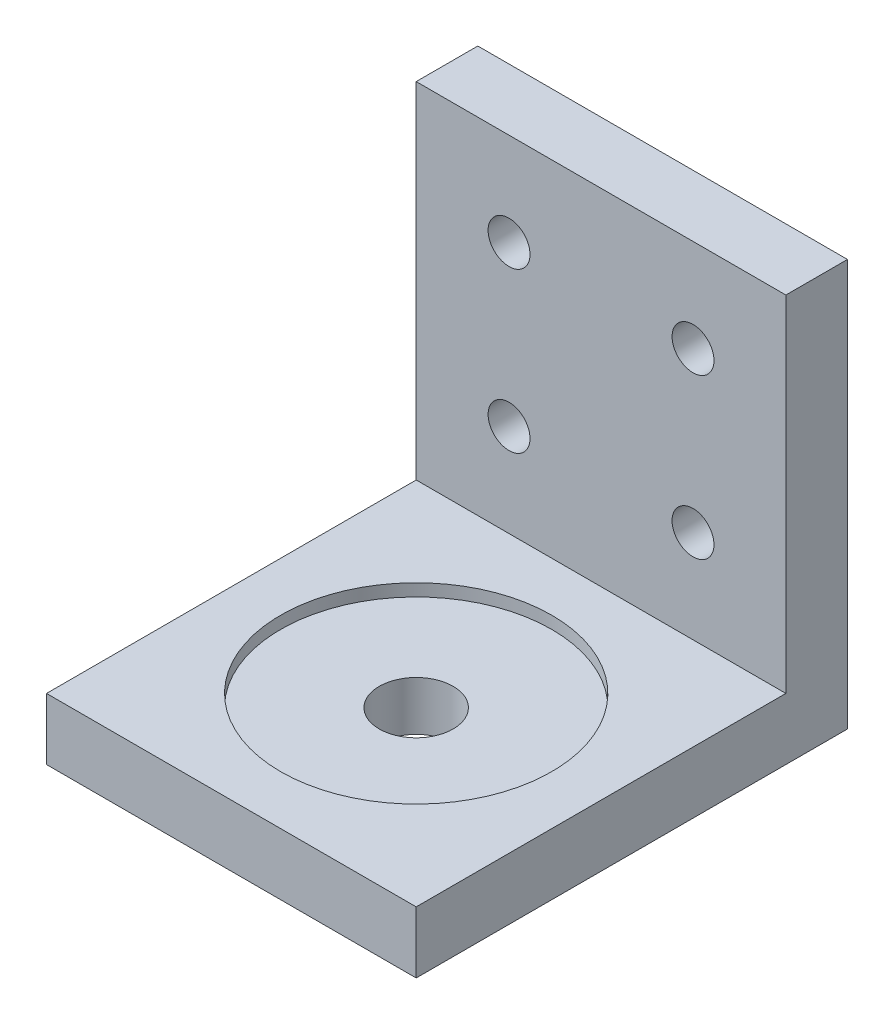
ISO-10303-21;
HEADER;
FILE_DESCRIPTION(('STEP AP214'),'2;1');
FILE_NAME('part.step','',(''),(''),'','','');
FILE_SCHEMA(('AUTOMOTIVE_DESIGN { 1 0 10303 214 1 1 1 1 }'));
ENDSEC;
DATA;
#1=APPLICATION_CONTEXT('core data for automotive mechanical design processes');
#2=APPLICATION_PROTOCOL_DEFINITION('international standard','automotive_design',2000,#1);
#3=PRODUCT_CONTEXT('',#1,'mechanical');
#4=PRODUCT('Part','Part','',(#3));
#5=PRODUCT_RELATED_PRODUCT_CATEGORY('part','',(#4));
#6=PRODUCT_DEFINITION_FORMATION('','',#4);
#7=PRODUCT_DEFINITION_CONTEXT('part definition',#1,'design');
#8=PRODUCT_DEFINITION('design','',#6,#7);
#9=PRODUCT_DEFINITION_SHAPE('','',#8);
#10=(LENGTH_UNIT() NAMED_UNIT(*) SI_UNIT(.MILLI.,.METRE.));
#11=(NAMED_UNIT(*) PLANE_ANGLE_UNIT() SI_UNIT($,.RADIAN.));
#12=(NAMED_UNIT(*) SI_UNIT($,.STERADIAN.) SOLID_ANGLE_UNIT());
#13=UNCERTAINTY_MEASURE_WITH_UNIT(LENGTH_MEASURE(1.E-05),#10,'distance_accuracy_value','');
#14=(GEOMETRIC_REPRESENTATION_CONTEXT(3) GLOBAL_UNCERTAINTY_ASSIGNED_CONTEXT((#13)) GLOBAL_UNIT_ASSIGNED_CONTEXT((#10,
#11,#12)) REPRESENTATION_CONTEXT('',''));
#15=CARTESIAN_POINT('',(0.,0.,0.));
#16=DIRECTION('',(0.,0.,1.));
#17=DIRECTION('',(1.,0.,0.));
#18=AXIS2_PLACEMENT_3D('',#15,#16,#17);
#19=CARTESIAN_POINT('',(-15.,5.,18.6650246305419));
#20=DIRECTION('',(1.,0.,0.));
#21=DIRECTION('',(0.,0.,-1.));
#22=AXIS2_PLACEMENT_3D('',#19,#20,#21);
#23=PLANE('',#22);
#24=DIRECTION('',(0.,0.,1.));
#25=VECTOR('',#24,1.);
#26=CARTESIAN_POINT('',(-15.,0.,18.6650246305419));
#27=LINE('',#26,#25);
#28=CARTESIAN_POINT('',(-15.,0.,-16.3349753694581));
#29=VERTEX_POINT('',#28);
#30=CARTESIAN_POINT('',(-15.,0.,18.6650246305419));
#31=VERTEX_POINT('',#30);
#32=EDGE_CURVE('E103',#29,#31,#27,.T.);
#33=ORIENTED_EDGE('',*,*,#32,.T.);
#34=DIRECTION('',(0.,-1.,0.));
#35=VECTOR('',#34,1.);
#36=CARTESIAN_POINT('',(-15.,5.,18.6650246305419));
#37=LINE('',#36,#35);
#38=CARTESIAN_POINT('',(-15.,5.,18.6650246305419));
#39=VERTEX_POINT('',#38);
#40=EDGE_CURVE('E11',#39,#31,#37,.T.);
#41=ORIENTED_EDGE('',*,*,#40,.F.);
#42=DIRECTION('',(0.,0.,1.));
#43=VECTOR('',#42,1.);
#44=CARTESIAN_POINT('',(-15.,5.,18.6650246305419));
#45=LINE('',#44,#43);
#46=CARTESIAN_POINT('',(-15.,5.,-11.3349753694581));
#47=VERTEX_POINT('',#46);
#48=EDGE_CURVE('E92',#47,#39,#45,.T.);
#49=ORIENTED_EDGE('',*,*,#48,.F.);
#50=DIRECTION('',(0.,-1.,0.));
#51=VECTOR('',#50,1.);
#52=CARTESIAN_POINT('',(-15.,33.,-11.3349753694581));
#53=LINE('',#52,#51);
#54=CARTESIAN_POINT('',(-15.,33.,-11.3349753694581));
#55=VERTEX_POINT('',#54);
#56=EDGE_CURVE('E60',#55,#47,#53,.T.);
#57=ORIENTED_EDGE('',*,*,#56,.F.);
#58=DIRECTION('',(0.,0.,1.));
#59=VECTOR('',#58,1.);
#60=CARTESIAN_POINT('',(-15.,33.,-11.3349753694581));
#61=LINE('',#60,#59);
#62=CARTESIAN_POINT('',(-15.,33.,-16.3349753694581));
#63=VERTEX_POINT('',#62);
#64=EDGE_CURVE('E145',#63,#55,#61,.T.);
#65=ORIENTED_EDGE('',*,*,#64,.F.);
#66=DIRECTION('',(0.,-1.,0.));
#67=VECTOR('',#66,1.);
#68=CARTESIAN_POINT('',(-15.,33.,-16.3349753694581));
#69=LINE('',#68,#67);
#70=EDGE_CURVE('E106',#63,#29,#69,.T.);
#71=ORIENTED_EDGE('',*,*,#70,.T.);
#72=EDGE_LOOP('',(#33,#41,#49,#57,#65,#71));
#73=FACE_BOUND('',#72,.T.);
#74=ADVANCED_FACE('F39',(#73),#23,.F.);
#75=CARTESIAN_POINT('',(15.,5.,18.6650246305419));
#76=DIRECTION('',(0.,0.,-1.));
#77=DIRECTION('',(-1.,0.,0.));
#78=AXIS2_PLACEMENT_3D('',#75,#76,#77);
#79=PLANE('',#78);
#80=DIRECTION('',(1.,0.,0.));
#81=VECTOR('',#80,1.);
#82=CARTESIAN_POINT('',(15.,0.,18.6650246305419));
#83=LINE('',#82,#81);
#84=CARTESIAN_POINT('',(15.,0.,18.6650246305419));
#85=VERTEX_POINT('',#84);
#86=EDGE_CURVE('E67',#31,#85,#83,.T.);
#87=ORIENTED_EDGE('',*,*,#86,.T.);
#88=DIRECTION('',(0.,-1.,0.));
#89=VECTOR('',#88,1.);
#90=CARTESIAN_POINT('',(15.,5.,18.6650246305419));
#91=LINE('',#90,#89);
#92=CARTESIAN_POINT('',(15.,5.,18.6650246305419));
#93=VERTEX_POINT('',#92);
#94=EDGE_CURVE('E48',#93,#85,#91,.T.);
#95=ORIENTED_EDGE('',*,*,#94,.F.);
#96=DIRECTION('',(1.,0.,0.));
#97=VECTOR('',#96,1.);
#98=CARTESIAN_POINT('',(15.,5.,18.6650246305419));
#99=LINE('',#98,#97);
#100=EDGE_CURVE('E82',#39,#93,#99,.T.);
#101=ORIENTED_EDGE('',*,*,#100,.F.);
#102=ORIENTED_EDGE('',*,*,#40,.T.);
#103=EDGE_LOOP('',(#87,#95,#101,#102));
#104=FACE_BOUND('',#103,.T.);
#105=ADVANCED_FACE('F87',(#104),#79,.F.);
#106=CARTESIAN_POINT('',(15.,5.,18.6650246305419));
#107=DIRECTION('',(-1.,0.,0.));
#108=DIRECTION('',(0.,0.,1.));
#109=AXIS2_PLACEMENT_3D('',#106,#107,#108);
#110=PLANE('',#109);
#111=DIRECTION('',(0.,0.,-1.));
#112=VECTOR('',#111,1.);
#113=CARTESIAN_POINT('',(15.,0.,18.6650246305419));
#114=LINE('',#113,#112);
#115=CARTESIAN_POINT('',(15.,0.,-16.3349753694581));
#116=VERTEX_POINT('',#115);
#117=EDGE_CURVE('E99',#85,#116,#114,.T.);
#118=ORIENTED_EDGE('',*,*,#117,.T.);
#119=DIRECTION('',(0.,-1.,0.));
#120=VECTOR('',#119,1.);
#121=CARTESIAN_POINT('',(15.,33.,-16.3349753694581));
#122=LINE('',#121,#120);
#123=CARTESIAN_POINT('',(15.,33.,-16.3349753694581));
#124=VERTEX_POINT('',#123);
#125=EDGE_CURVE('E146',#124,#116,#122,.T.);
#126=ORIENTED_EDGE('',*,*,#125,.F.);
#127=DIRECTION('',(0.,0.,-1.));
#128=VECTOR('',#127,1.);
#129=CARTESIAN_POINT('',(15.,33.,-11.3349753694581));
#130=LINE('',#129,#128);
#131=CARTESIAN_POINT('',(15.,33.,-11.3349753694581));
#132=VERTEX_POINT('',#131);
#133=EDGE_CURVE('E137',#132,#124,#130,.T.);
#134=ORIENTED_EDGE('',*,*,#133,.F.);
#135=DIRECTION('',(0.,-1.,0.));
#136=VECTOR('',#135,1.);
#137=CARTESIAN_POINT('',(15.,33.,-11.3349753694581));
#138=LINE('',#137,#136);
#139=CARTESIAN_POINT('',(15.,5.,-11.3349753694581));
#140=VERTEX_POINT('',#139);
#141=EDGE_CURVE('E147',#132,#140,#138,.T.);
#142=ORIENTED_EDGE('',*,*,#141,.T.);
#143=DIRECTION('',(0.,0.,-1.));
#144=VECTOR('',#143,1.);
#145=CARTESIAN_POINT('',(15.,5.,18.6650246305419));
#146=LINE('',#145,#144);
#147=EDGE_CURVE('E94',#93,#140,#146,.T.);
#148=ORIENTED_EDGE('',*,*,#147,.F.);
#149=ORIENTED_EDGE('',*,*,#94,.T.);
#150=EDGE_LOOP('',(#118,#126,#134,#142,#148,#149));
#151=FACE_BOUND('',#150,.T.);
#152=ADVANCED_FACE('F152',(#151),#110,.F.);
#153=CARTESIAN_POINT('',(0.,5.,0.));
#154=DIRECTION('',(0.,1.,0.));
#155=DIRECTION('',(0.,0.,1.));
#156=AXIS2_PLACEMENT_3D('',#153,#154,#155);
#157=PLANE('',#156);
#158=CARTESIAN_POINT('',(0.,5.,3.66502463054187));
#159=DIRECTION('',(0.,1.,0.));
#160=DIRECTION('',(0.,0.,1.));
#161=AXIS2_PLACEMENT_3D('',#158,#159,#160);
#162=CIRCLE('',#161,11.);
#163=CARTESIAN_POINT('',(0.,5.,14.6650246305419));
#164=VERTEX_POINT('',#163);
#165=EDGE_CURVE('E114',#164,#164,#162,.T.);
#166=ORIENTED_EDGE('',*,*,#165,.F.);
#167=EDGE_LOOP('',(#166));
#168=FACE_BOUND('',#167,.T.);
#169=ORIENTED_EDGE('',*,*,#48,.T.);
#170=ORIENTED_EDGE('',*,*,#100,.T.);
#171=ORIENTED_EDGE('',*,*,#147,.T.);
#172=DIRECTION('',(-1.,0.,0.));
#173=VECTOR('',#172,1.);
#174=CARTESIAN_POINT('',(15.,5.,-11.3349753694581));
#175=LINE('',#174,#173);
#176=EDGE_CURVE('E74',#140,#47,#175,.T.);
#177=ORIENTED_EDGE('',*,*,#176,.T.);
#178=EDGE_LOOP('',(#169,#170,#171,#177));
#179=FACE_BOUND('',#178,.T.);
#180=ADVANCED_FACE('F98',(#168,#179),#157,.T.);
#181=CARTESIAN_POINT('',(0.,0.,0.));
#182=DIRECTION('',(0.,1.,0.));
#183=DIRECTION('',(0.,0.,1.));
#184=AXIS2_PLACEMENT_3D('',#181,#182,#183);
#185=PLANE('',#184);
#186=CARTESIAN_POINT('',(0.,0.,3.66502463054187));
#187=DIRECTION('',(0.,1.,0.));
#188=DIRECTION('',(0.,0.,1.));
#189=AXIS2_PLACEMENT_3D('',#186,#187,#188);
#190=CIRCLE('',#189,3.);
#191=CARTESIAN_POINT('',(0.,0.,6.66502463054187));
#192=VERTEX_POINT('',#191);
#193=EDGE_CURVE('E45',#192,#192,#190,.T.);
#194=ORIENTED_EDGE('',*,*,#193,.T.);
#195=EDGE_LOOP('',(#194));
#196=FACE_BOUND('',#195,.T.);
#197=ORIENTED_EDGE('',*,*,#32,.F.);
#198=DIRECTION('',(-1.,0.,0.));
#199=VECTOR('',#198,1.);
#200=CARTESIAN_POINT('',(15.,0.,-16.3349753694581));
#201=LINE('',#200,#199);
#202=EDGE_CURVE('E135',#116,#29,#201,.T.);
#203=ORIENTED_EDGE('',*,*,#202,.F.);
#204=ORIENTED_EDGE('',*,*,#117,.F.);
#205=ORIENTED_EDGE('',*,*,#86,.F.);
#206=EDGE_LOOP('',(#197,#203,#204,#205));
#207=FACE_BOUND('',#206,.T.);
#208=ADVANCED_FACE('F166',(#196,#207),#185,.F.);
#209=CARTESIAN_POINT('',(0.,4.,3.66502463054187));
#210=DIRECTION('',(0.,1.,0.));
#211=DIRECTION('',(0.,0.,1.));
#212=AXIS2_PLACEMENT_3D('',#209,#210,#211);
#213=CYLINDRICAL_SURFACE('',#212,11.);
#214=CARTESIAN_POINT('',(0.,4.,3.66502463054187));
#215=DIRECTION('',(0.,1.,0.));
#216=DIRECTION('',(0.,0.,1.));
#217=AXIS2_PLACEMENT_3D('',#214,#215,#216);
#218=CIRCLE('',#217,11.);
#219=CARTESIAN_POINT('',(0.,4.,14.6650246305419));
#220=VERTEX_POINT('',#219);
#221=EDGE_CURVE('E108',#220,#220,#218,.T.);
#222=ORIENTED_EDGE('',*,*,#221,.F.);
#223=EDGE_LOOP('',(#222));
#224=FACE_BOUND('',#223,.T.);
#225=ORIENTED_EDGE('',*,*,#165,.T.);
#226=EDGE_LOOP('',(#225));
#227=FACE_BOUND('',#226,.T.);
#228=ADVANCED_FACE('F171',(#224,#227),#213,.F.);
#229=CARTESIAN_POINT('',(0.,4.,3.66502463054187));
#230=DIRECTION('',(0.,1.,0.));
#231=DIRECTION('',(0.,0.,1.));
#232=AXIS2_PLACEMENT_3D('',#229,#230,#231);
#233=PLANE('',#232);
#234=CARTESIAN_POINT('',(0.,4.,3.66502463054187));
#235=DIRECTION('',(0.,1.,0.));
#236=DIRECTION('',(0.,0.,1.));
#237=AXIS2_PLACEMENT_3D('',#234,#235,#236);
#238=CIRCLE('',#237,3.);
#239=CARTESIAN_POINT('',(0.,4.,6.66502463054187));
#240=VERTEX_POINT('',#239);
#241=EDGE_CURVE('E319',#240,#240,#238,.T.);
#242=ORIENTED_EDGE('',*,*,#241,.F.);
#243=EDGE_LOOP('',(#242));
#244=FACE_BOUND('',#243,.T.);
#245=ORIENTED_EDGE('',*,*,#221,.T.);
#246=EDGE_LOOP('',(#245));
#247=FACE_BOUND('',#246,.T.);
#248=ADVANCED_FACE('F179',(#244,#247),#233,.T.);
#249=CARTESIAN_POINT('',(-15.,33.,-11.3349753694581));
#250=DIRECTION('',(0.,0.,-1.));
#251=DIRECTION('',(-1.,0.,0.));
#252=AXIS2_PLACEMENT_3D('',#249,#250,#251);
#253=PLANE('',#252);
#254=CARTESIAN_POINT('',(-7.46435652487382,25.4675408555637,-11.3349753694581));
#255=DIRECTION('',(0.,0.,1.));
#256=DIRECTION('',(-1.,0.,0.));
#257=AXIS2_PLACEMENT_3D('',#254,#255,#256);
#258=CIRCLE('',#257,1.7);
#259=CARTESIAN_POINT('',(-9.16435652487382,25.4675408555637,-11.3349753694581));
#260=VERTEX_POINT('',#259);
#261=EDGE_CURVE('E324',#260,#260,#258,.T.);
#262=ORIENTED_EDGE('',*,*,#261,.F.);
#263=EDGE_LOOP('',(#262));
#264=FACE_BOUND('',#263,.T.);
#265=CARTESIAN_POINT('',(7.46435652487382,25.4675408555637,-11.3349753694581));
#266=DIRECTION('',(0.,0.,1.));
#267=DIRECTION('',(1.,0.,0.));
#268=AXIS2_PLACEMENT_3D('',#265,#266,#267);
#269=CIRCLE('',#268,1.7);
#270=CARTESIAN_POINT('',(9.16435652487382,25.4675408555637,-11.3349753694581));
#271=VERTEX_POINT('',#270);
#272=EDGE_CURVE('E329',#271,#271,#269,.T.);
#273=ORIENTED_EDGE('',*,*,#272,.F.);
#274=EDGE_LOOP('',(#273));
#275=FACE_BOUND('',#274,.T.);
#276=CARTESIAN_POINT('',(7.46435652487382,12.5324591444364,-11.3349753694581));
#277=DIRECTION('',(0.,0.,1.));
#278=DIRECTION('',(-1.,0.,0.));
#279=AXIS2_PLACEMENT_3D('',#276,#277,#278);
#280=CIRCLE('',#279,1.7);
#281=CARTESIAN_POINT('',(5.76435652487382,12.5324591444364,-11.3349753694581));
#282=VERTEX_POINT('',#281);
#283=EDGE_CURVE('E330',#282,#282,#280,.T.);
#284=ORIENTED_EDGE('',*,*,#283,.F.);
#285=EDGE_LOOP('',(#284));
#286=FACE_BOUND('',#285,.T.);
#287=CARTESIAN_POINT('',(-7.46435652487382,12.5324591444364,-11.3349753694581));
#288=DIRECTION('',(0.,0.,1.));
#289=DIRECTION('',(1.,0.,0.));
#290=AXIS2_PLACEMENT_3D('',#287,#288,#289);
#291=CIRCLE('',#290,1.7);
#292=CARTESIAN_POINT('',(-5.76435652487382,12.5324591444364,-11.3349753694581));
#293=VERTEX_POINT('',#292);
#294=EDGE_CURVE('E122',#293,#293,#291,.T.);
#295=ORIENTED_EDGE('',*,*,#294,.F.);
#296=EDGE_LOOP('',(#295));
#297=FACE_BOUND('',#296,.T.);
#298=ORIENTED_EDGE('',*,*,#176,.F.);
#299=ORIENTED_EDGE('',*,*,#141,.F.);
#300=DIRECTION('',(1.,0.,0.));
#301=VECTOR('',#300,1.);
#302=CARTESIAN_POINT('',(-15.,33.,-11.3349753694581));
#303=LINE('',#302,#301);
#304=EDGE_CURVE('E134',#55,#132,#303,.T.);
#305=ORIENTED_EDGE('',*,*,#304,.F.);
#306=ORIENTED_EDGE('',*,*,#56,.T.);
#307=EDGE_LOOP('',(#298,#299,#305,#306));
#308=FACE_BOUND('',#307,.T.);
#309=ADVANCED_FACE('F157',(#264,#275,#286,#297,#308),#253,.F.);
#310=CARTESIAN_POINT('',(15.,33.,-16.3349753694581));
#311=DIRECTION('',(0.,0.,1.));
#312=DIRECTION('',(1.,0.,0.));
#313=AXIS2_PLACEMENT_3D('',#310,#311,#312);
#314=PLANE('',#313);
#315=CARTESIAN_POINT('',(-7.46435652487382,25.4675408555637,-16.3349753694581));
#316=DIRECTION('',(0.,0.,1.));
#317=DIRECTION('',(1.,0.,0.));
#318=AXIS2_PLACEMENT_3D('',#315,#316,#317);
#319=CIRCLE('',#318,1.7);
#320=CARTESIAN_POINT('',(-5.76435652487382,25.4675408555637,-16.3349753694581));
#321=VERTEX_POINT('',#320);
#322=EDGE_CURVE('E128',#321,#321,#319,.T.);
#323=ORIENTED_EDGE('',*,*,#322,.T.);
#324=EDGE_LOOP('',(#323));
#325=FACE_BOUND('',#324,.T.);
#326=CARTESIAN_POINT('',(7.46435652487382,25.4675408555637,-16.3349753694581));
#327=DIRECTION('',(0.,0.,1.));
#328=DIRECTION('',(1.,0.,0.));
#329=AXIS2_PLACEMENT_3D('',#326,#327,#328);
#330=CIRCLE('',#329,1.7);
#331=CARTESIAN_POINT('',(9.16435652487382,25.4675408555637,-16.3349753694581));
#332=VERTEX_POINT('',#331);
#333=EDGE_CURVE('E126',#332,#332,#330,.T.);
#334=ORIENTED_EDGE('',*,*,#333,.T.);
#335=EDGE_LOOP('',(#334));
#336=FACE_BOUND('',#335,.T.);
#337=CARTESIAN_POINT('',(7.46435652487382,12.5324591444364,-16.3349753694581));
#338=DIRECTION('',(0.,0.,1.));
#339=DIRECTION('',(1.,0.,0.));
#340=AXIS2_PLACEMENT_3D('',#337,#338,#339);
#341=CIRCLE('',#340,1.7);
#342=CARTESIAN_POINT('',(9.16435652487382,12.5324591444364,-16.3349753694581));
#343=VERTEX_POINT('',#342);
#344=EDGE_CURVE('E124',#343,#343,#341,.T.);
#345=ORIENTED_EDGE('',*,*,#344,.T.);
#346=EDGE_LOOP('',(#345));
#347=FACE_BOUND('',#346,.T.);
#348=CARTESIAN_POINT('',(-7.46435652487382,12.5324591444364,-16.3349753694581));
#349=DIRECTION('',(0.,0.,1.));
#350=DIRECTION('',(1.,0.,0.));
#351=AXIS2_PLACEMENT_3D('',#348,#349,#350);
#352=CIRCLE('',#351,1.7);
#353=CARTESIAN_POINT('',(-5.76435652487382,12.5324591444364,-16.3349753694581));
#354=VERTEX_POINT('',#353);
#355=EDGE_CURVE('E123',#354,#354,#352,.T.);
#356=ORIENTED_EDGE('',*,*,#355,.T.);
#357=EDGE_LOOP('',(#356));
#358=FACE_BOUND('',#357,.T.);
#359=ORIENTED_EDGE('',*,*,#202,.T.);
#360=ORIENTED_EDGE('',*,*,#70,.F.);
#361=DIRECTION('',(-1.,0.,0.));
#362=VECTOR('',#361,1.);
#363=CARTESIAN_POINT('',(15.,33.,-16.3349753694581));
#364=LINE('',#363,#362);
#365=EDGE_CURVE('E169',#124,#63,#364,.T.);
#366=ORIENTED_EDGE('',*,*,#365,.F.);
#367=ORIENTED_EDGE('',*,*,#125,.T.);
#368=EDGE_LOOP('',(#359,#360,#366,#367));
#369=FACE_BOUND('',#368,.T.);
#370=ADVANCED_FACE('F170',(#325,#336,#347,#358,#369),#314,.F.);
#371=CARTESIAN_POINT('',(0.,33.,0.));
#372=DIRECTION('',(0.,1.,0.));
#373=DIRECTION('',(0.,0.,1.));
#374=AXIS2_PLACEMENT_3D('',#371,#372,#373);
#375=PLANE('',#374);
#376=ORIENTED_EDGE('',*,*,#304,.T.);
#377=ORIENTED_EDGE('',*,*,#133,.T.);
#378=ORIENTED_EDGE('',*,*,#365,.T.);
#379=ORIENTED_EDGE('',*,*,#64,.T.);
#380=EDGE_LOOP('',(#376,#377,#378,#379));
#381=FACE_BOUND('',#380,.T.);
#382=ADVANCED_FACE('F206',(#381),#375,.T.);
#383=CARTESIAN_POINT('',(-7.46435652487382,12.5324591444364,-20.7129753694581));
#384=DIRECTION('',(0.,0.,1.));
#385=DIRECTION('',(1.,0.,0.));
#386=AXIS2_PLACEMENT_3D('',#383,#384,#385);
#387=CYLINDRICAL_SURFACE('',#386,1.7);
#388=ORIENTED_EDGE('',*,*,#294,.T.);
#389=EDGE_LOOP('',(#388));
#390=FACE_BOUND('',#389,.T.);
#391=ORIENTED_EDGE('',*,*,#355,.F.);
#392=EDGE_LOOP('',(#391));
#393=FACE_BOUND('',#392,.T.);
#394=ADVANCED_FACE('F209',(#390,#393),#387,.F.);
#395=CARTESIAN_POINT('',(7.46435652487382,12.5324591444364,-20.7129753694581));
#396=DIRECTION('',(0.,0.,1.));
#397=DIRECTION('',(1.,0.,0.));
#398=AXIS2_PLACEMENT_3D('',#395,#396,#397);
#399=CYLINDRICAL_SURFACE('',#398,1.7);
#400=ORIENTED_EDGE('',*,*,#283,.T.);
#401=EDGE_LOOP('',(#400));
#402=FACE_BOUND('',#401,.T.);
#403=ORIENTED_EDGE('',*,*,#344,.F.);
#404=EDGE_LOOP('',(#403));
#405=FACE_BOUND('',#404,.T.);
#406=ADVANCED_FACE('F234',(#402,#405),#399,.F.);
#407=CARTESIAN_POINT('',(7.46435652487382,25.4675408555637,-20.7129753694581));
#408=DIRECTION('',(0.,0.,1.));
#409=DIRECTION('',(1.,0.,0.));
#410=AXIS2_PLACEMENT_3D('',#407,#408,#409);
#411=CYLINDRICAL_SURFACE('',#410,1.7);
#412=ORIENTED_EDGE('',*,*,#272,.T.);
#413=EDGE_LOOP('',(#412));
#414=FACE_BOUND('',#413,.T.);
#415=ORIENTED_EDGE('',*,*,#333,.F.);
#416=EDGE_LOOP('',(#415));
#417=FACE_BOUND('',#416,.T.);
#418=ADVANCED_FACE('F242',(#414,#417),#411,.F.);
#419=CARTESIAN_POINT('',(-7.46435652487382,25.4675408555637,-20.7129753694581));
#420=DIRECTION('',(0.,0.,1.));
#421=DIRECTION('',(1.,0.,0.));
#422=AXIS2_PLACEMENT_3D('',#419,#420,#421);
#423=CYLINDRICAL_SURFACE('',#422,1.7);
#424=ORIENTED_EDGE('',*,*,#261,.T.);
#425=EDGE_LOOP('',(#424));
#426=FACE_BOUND('',#425,.T.);
#427=ORIENTED_EDGE('',*,*,#322,.F.);
#428=EDGE_LOOP('',(#427));
#429=FACE_BOUND('',#428,.T.);
#430=ADVANCED_FACE('F253',(#426,#429),#423,.F.);
#431=CARTESIAN_POINT('',(0.,-5.37799999999999,3.66502463054187));
#432=DIRECTION('',(0.,1.,0.));
#433=DIRECTION('',(0.,0.,1.));
#434=AXIS2_PLACEMENT_3D('',#431,#432,#433);
#435=CYLINDRICAL_SURFACE('',#434,3.);
#436=ORIENTED_EDGE('',*,*,#241,.T.);
#437=EDGE_LOOP('',(#436));
#438=FACE_BOUND('',#437,.T.);
#439=ORIENTED_EDGE('',*,*,#193,.F.);
#440=EDGE_LOOP('',(#439));
#441=FACE_BOUND('',#440,.T.);
#442=ADVANCED_FACE('F259',(#438,#441),#435,.F.);
#443=CLOSED_SHELL('',(#74,#105,#152,#180,#208,#228,#248,#309,#370,#382,#394,#406,#418,#430,#442));
#444=MANIFOLD_SOLID_BREP('B2',#443);
#445=ADVANCED_BREP_SHAPE_REPRESENTATION('',(#18,#444),#14);
#446=SHAPE_DEFINITION_REPRESENTATION(#9,#445);
ENDSEC;
END-ISO-10303-21;
